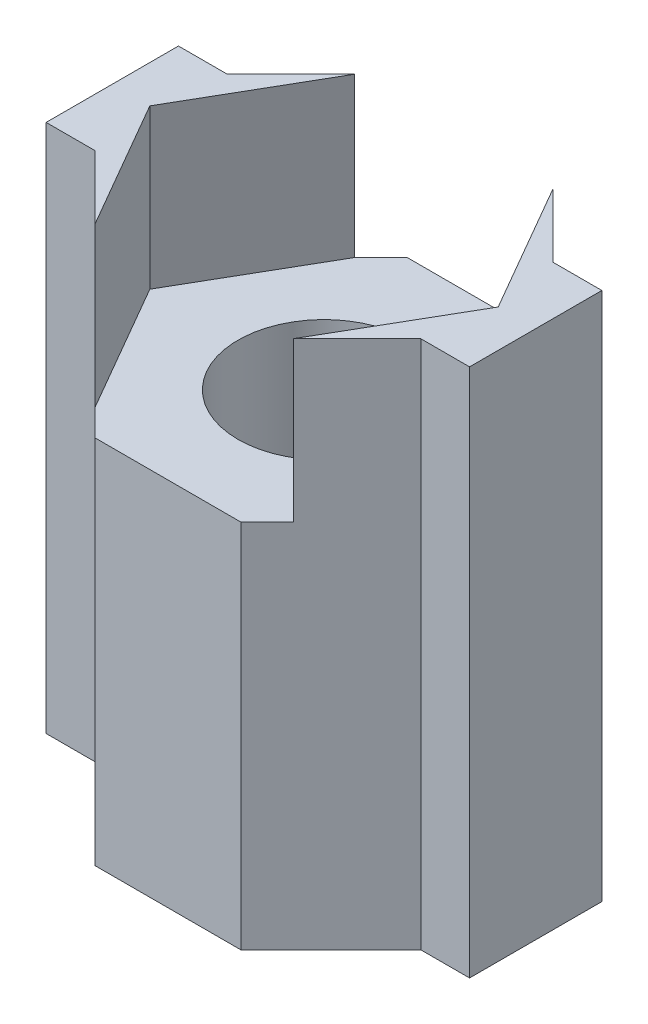
ISO-10303-21;
HEADER;
FILE_DESCRIPTION(('STEP AP214'),'2;1');
FILE_NAME('part.step','',(''),(''),'','','');
FILE_SCHEMA(('AUTOMOTIVE_DESIGN { 1 0 10303 214 1 1 1 1 }'));
ENDSEC;
DATA;
#1=APPLICATION_CONTEXT('core data for automotive mechanical design processes');
#2=APPLICATION_PROTOCOL_DEFINITION('international standard','automotive_design',2000,#1);
#3=PRODUCT_CONTEXT('',#1,'mechanical');
#4=PRODUCT('Part','Part','',(#3));
#5=PRODUCT_RELATED_PRODUCT_CATEGORY('part','',(#4));
#6=PRODUCT_DEFINITION_FORMATION('','',#4);
#7=PRODUCT_DEFINITION_CONTEXT('part definition',#1,'design');
#8=PRODUCT_DEFINITION('design','',#6,#7);
#9=PRODUCT_DEFINITION_SHAPE('','',#8);
#10=(LENGTH_UNIT() NAMED_UNIT(*) SI_UNIT(.MILLI.,.METRE.));
#11=(NAMED_UNIT(*) PLANE_ANGLE_UNIT() SI_UNIT($,.RADIAN.));
#12=(NAMED_UNIT(*) SI_UNIT($,.STERADIAN.) SOLID_ANGLE_UNIT());
#13=UNCERTAINTY_MEASURE_WITH_UNIT(LENGTH_MEASURE(1.E-05),#10,'distance_accuracy_value','');
#14=(GEOMETRIC_REPRESENTATION_CONTEXT(3) GLOBAL_UNCERTAINTY_ASSIGNED_CONTEXT((#13)) GLOBAL_UNIT_ASSIGNED_CONTEXT((#10,
#11,#12)) REPRESENTATION_CONTEXT('',''));
#15=CARTESIAN_POINT('',(0.,0.,0.));
#16=DIRECTION('',(0.,0.,1.));
#17=DIRECTION('',(1.,0.,0.));
#18=AXIS2_PLACEMENT_3D('',#15,#16,#17);
#19=CARTESIAN_POINT('',(0.,20.,0.));
#20=DIRECTION('',(0.,-1.,0.));
#21=DIRECTION('',(0.,0.,-1.));
#22=AXIS2_PLACEMENT_3D('',#19,#20,#21);
#23=PLANE('',#22);
#24=DIRECTION('',(0.707106781186547,0.,0.707106781186548));
#25=VECTOR('',#24,1.);
#26=CARTESIAN_POINT('',(-2.75649711574559,20.,5.90000000000002));
#27=LINE('',#26,#25);
#28=CARTESIAN_POINT('',(-6.1564971157456,20.,2.5));
#29=VERTEX_POINT('',#28);
#30=CARTESIAN_POINT('',(-3.74769463524738,20.,4.90880248049823));
#31=VERTEX_POINT('',#30);
#32=EDGE_CURVE('E243',#29,#31,#27,.T.);
#33=ORIENTED_EDGE('',*,*,#32,.T.);
#34=DIRECTION('',(0.5,0.,0.866025403784439));
#35=VECTOR('',#34,1.);
#36=CARTESIAN_POINT('',(-6.58179306876174,20.,0.));
#37=LINE('',#36,#35);
#38=CARTESIAN_POINT('',(-6.58179306876174,20.,0.));
#39=VERTEX_POINT('',#38);
#40=EDGE_CURVE('E224',#39,#31,#37,.T.);
#41=ORIENTED_EDGE('',*,*,#40,.F.);
#42=DIRECTION('',(0.5,0.,-0.866025403784439));
#43=VECTOR('',#42,1.);
#44=CARTESIAN_POINT('',(-4.9363448015713,20.,-2.85));
#45=LINE('',#44,#43);
#46=CARTESIAN_POINT('',(-3.74769463524745,20.,-4.9088024804981));
#47=VERTEX_POINT('',#46);
#48=EDGE_CURVE('E41',#39,#47,#45,.T.);
#49=ORIENTED_EDGE('',*,*,#48,.T.);
#50=DIRECTION('',(-0.707106781186547,0.,0.707106781186548));
#51=VECTOR('',#50,1.);
#52=CARTESIAN_POINT('',(-6.15649711574556,20.,-2.5));
#53=LINE('',#52,#51);
#54=CARTESIAN_POINT('',(-6.15649711574556,20.,-2.5));
#55=VERTEX_POINT('',#54);
#56=EDGE_CURVE('E157',#47,#55,#53,.T.);
#57=ORIENTED_EDGE('',*,*,#56,.T.);
#58=DIRECTION('',(-1.,0.,0.));
#59=VECTOR('',#58,1.);
#60=CARTESIAN_POINT('',(-8.00000000000005,20.,-2.5));
#61=LINE('',#60,#59);
#62=CARTESIAN_POINT('',(-8.00000000000005,20.,-2.5));
#63=VERTEX_POINT('',#62);
#64=EDGE_CURVE('E57',#55,#63,#61,.T.);
#65=ORIENTED_EDGE('',*,*,#64,.T.);
#66=DIRECTION('',(0.,0.,1.));
#67=VECTOR('',#66,1.);
#68=CARTESIAN_POINT('',(-8.00000000000005,20.,2.5));
#69=LINE('',#68,#67);
#70=CARTESIAN_POINT('',(-8.00000000000005,20.,2.5));
#71=VERTEX_POINT('',#70);
#72=EDGE_CURVE('E191',#63,#71,#69,.T.);
#73=ORIENTED_EDGE('',*,*,#72,.T.);
#74=DIRECTION('',(1.,0.,0.));
#75=VECTOR('',#74,1.);
#76=CARTESIAN_POINT('',(-6.1564971157456,20.,2.5));
#77=LINE('',#76,#75);
#78=EDGE_CURVE('E111',#71,#29,#77,.T.);
#79=ORIENTED_EDGE('',*,*,#78,.T.);
#80=EDGE_LOOP('',(#33,#41,#49,#57,#65,#73,#79));
#81=FACE_BOUND('',#80,.T.);
#82=ADVANCED_FACE('F33',(#81),#23,.F.);
#83=CARTESIAN_POINT('',(-8.00000000000005,20.,2.5));
#84=DIRECTION('',(1.,0.,0.));
#85=DIRECTION('',(0.,0.,-1.));
#86=AXIS2_PLACEMENT_3D('',#83,#84,#85);
#87=PLANE('',#86);
#88=DIRECTION('',(0.,0.,1.));
#89=VECTOR('',#88,1.);
#90=CARTESIAN_POINT('',(-8.00000000000005,0.,2.5));
#91=LINE('',#90,#89);
#92=CARTESIAN_POINT('',(-8.00000000000005,0.,-2.5));
#93=VERTEX_POINT('',#92);
#94=CARTESIAN_POINT('',(-8.00000000000005,0.,2.5));
#95=VERTEX_POINT('',#94);
#96=EDGE_CURVE('E164',#93,#95,#91,.T.);
#97=ORIENTED_EDGE('',*,*,#96,.T.);
#98=DIRECTION('',(0.,-1.,0.));
#99=VECTOR('',#98,1.);
#100=CARTESIAN_POINT('',(-8.00000000000005,20.,2.5));
#101=LINE('',#100,#99);
#102=EDGE_CURVE('E212',#71,#95,#101,.T.);
#103=ORIENTED_EDGE('',*,*,#102,.F.);
#104=ORIENTED_EDGE('',*,*,#72,.F.);
#105=DIRECTION('',(0.,-1.,0.));
#106=VECTOR('',#105,1.);
#107=CARTESIAN_POINT('',(-8.00000000000005,20.,-2.5));
#108=LINE('',#107,#106);
#109=EDGE_CURVE('E163',#63,#93,#108,.T.);
#110=ORIENTED_EDGE('',*,*,#109,.T.);
#111=EDGE_LOOP('',(#97,#103,#104,#110));
#112=FACE_BOUND('',#111,.T.);
#113=ADVANCED_FACE('F35',(#112),#87,.F.);
#114=CARTESIAN_POINT('',(-6.1564971157456,20.,2.5));
#115=DIRECTION('',(0.,0.,-1.));
#116=DIRECTION('',(-1.,0.,0.));
#117=AXIS2_PLACEMENT_3D('',#114,#115,#116);
#118=PLANE('',#117);
#119=DIRECTION('',(1.,0.,0.));
#120=VECTOR('',#119,1.);
#121=CARTESIAN_POINT('',(-6.1564971157456,0.,2.5));
#122=LINE('',#121,#120);
#123=CARTESIAN_POINT('',(-6.1564971157456,0.,2.5));
#124=VERTEX_POINT('',#123);
#125=EDGE_CURVE('E167',#95,#124,#122,.T.);
#126=ORIENTED_EDGE('',*,*,#125,.T.);
#127=DIRECTION('',(0.,-1.,0.));
#128=VECTOR('',#127,1.);
#129=CARTESIAN_POINT('',(-6.1564971157456,20.,2.5));
#130=LINE('',#129,#128);
#131=EDGE_CURVE('E209',#29,#124,#130,.T.);
#132=ORIENTED_EDGE('',*,*,#131,.F.);
#133=ORIENTED_EDGE('',*,*,#78,.F.);
#134=ORIENTED_EDGE('',*,*,#102,.T.);
#135=EDGE_LOOP('',(#126,#132,#133,#134));
#136=FACE_BOUND('',#135,.T.);
#137=ADVANCED_FACE('F357',(#136),#118,.F.);
#138=CARTESIAN_POINT('',(-2.75649711574559,20.,5.90000000000002));
#139=DIRECTION('',(0.707106781186548,0.,-0.707106781186547));
#140=DIRECTION('',(-0.707106781186547,0.,-0.707106781186548));
#141=AXIS2_PLACEMENT_3D('',#138,#139,#140);
#142=PLANE('',#141);
#143=DIRECTION('',(-0.707106781186547,0.,-0.707106781186548));
#144=VECTOR('',#143,1.);
#145=CARTESIAN_POINT('',(-2.75649711574559,14.,5.90000000000002));
#146=LINE('',#145,#144);
#147=CARTESIAN_POINT('',(-2.75649711574559,14.,5.90000000000002));
#148=VERTEX_POINT('',#147);
#149=CARTESIAN_POINT('',(-3.74769463524738,14.,4.90880248049823));
#150=VERTEX_POINT('',#149);
#151=EDGE_CURVE('E168',#148,#150,#146,.T.);
#152=ORIENTED_EDGE('',*,*,#151,.T.);
#153=DIRECTION('',(0.,1.,0.));
#154=VECTOR('',#153,1.);
#155=CARTESIAN_POINT('',(-3.74769463524739,20.,4.90880248049822));
#156=LINE('',#155,#154);
#157=EDGE_CURVE('E280',#150,#31,#156,.T.);
#158=ORIENTED_EDGE('',*,*,#157,.T.);
#159=ORIENTED_EDGE('',*,*,#32,.F.);
#160=ORIENTED_EDGE('',*,*,#131,.T.);
#161=DIRECTION('',(0.707106781186547,0.,0.707106781186548));
#162=VECTOR('',#161,1.);
#163=CARTESIAN_POINT('',(-2.75649711574559,0.,5.90000000000002));
#164=LINE('',#163,#162);
#165=CARTESIAN_POINT('',(-2.75649711574559,0.,5.90000000000002));
#166=VERTEX_POINT('',#165);
#167=EDGE_CURVE('E170',#124,#166,#164,.T.);
#168=ORIENTED_EDGE('',*,*,#167,.T.);
#169=DIRECTION('',(0.,-1.,0.));
#170=VECTOR('',#169,1.);
#171=CARTESIAN_POINT('',(-2.75649711574559,20.,5.90000000000002));
#172=LINE('',#171,#170);
#173=EDGE_CURVE('E207',#148,#166,#172,.T.);
#174=ORIENTED_EDGE('',*,*,#173,.F.);
#175=EDGE_LOOP('',(#152,#158,#159,#160,#168,#174));
#176=FACE_BOUND('',#175,.T.);
#177=ADVANCED_FACE('F299',(#176),#142,.F.);
#178=CARTESIAN_POINT('',(2.75649711574554,20.,5.90000000000002));
#179=DIRECTION('',(0.,0.,-1.));
#180=DIRECTION('',(-1.,0.,0.));
#181=AXIS2_PLACEMENT_3D('',#178,#179,#180);
#182=PLANE('',#181);
#183=DIRECTION('',(0.,-1.,0.));
#184=VECTOR('',#183,1.);
#185=CARTESIAN_POINT('',(2.75649711574554,20.,5.90000000000002));
#186=LINE('',#185,#184);
#187=CARTESIAN_POINT('',(2.75649711574554,14.,5.90000000000002));
#188=VERTEX_POINT('',#187);
#189=CARTESIAN_POINT('',(2.75649711574554,0.,5.90000000000002));
#190=VERTEX_POINT('',#189);
#191=EDGE_CURVE('E205',#188,#190,#186,.T.);
#192=ORIENTED_EDGE('',*,*,#191,.F.);
#193=DIRECTION('',(-1.,0.,0.));
#194=VECTOR('',#193,1.);
#195=CARTESIAN_POINT('',(2.75649711574554,14.,5.90000000000002));
#196=LINE('',#195,#194);
#197=EDGE_CURVE('E289',#188,#148,#196,.T.);
#198=ORIENTED_EDGE('',*,*,#197,.T.);
#199=ORIENTED_EDGE('',*,*,#173,.T.);
#200=DIRECTION('',(1.,0.,0.));
#201=VECTOR('',#200,1.);
#202=CARTESIAN_POINT('',(2.75649711574554,0.,5.90000000000002));
#203=LINE('',#202,#201);
#204=EDGE_CURVE('E173',#166,#190,#203,.T.);
#205=ORIENTED_EDGE('',*,*,#204,.T.);
#206=EDGE_LOOP('',(#192,#198,#199,#205));
#207=FACE_BOUND('',#206,.T.);
#208=ADVANCED_FACE('F356',(#207),#182,.F.);
#209=CARTESIAN_POINT('',(6.15649711574556,20.,2.5));
#210=DIRECTION('',(-0.707106781186548,0.,-0.707106781186548));
#211=DIRECTION('',(-0.707106781186548,0.,0.707106781186548));
#212=AXIS2_PLACEMENT_3D('',#209,#210,#211);
#213=PLANE('',#212);
#214=DIRECTION('',(0.707106781186547,0.,-0.707106781186547));
#215=VECTOR('',#214,1.);
#216=CARTESIAN_POINT('',(6.15649711574556,20.,2.5));
#217=LINE('',#216,#215);
#218=CARTESIAN_POINT('',(3.74769463524745,20.,4.90880248049811));
#219=VERTEX_POINT('',#218);
#220=CARTESIAN_POINT('',(6.15649711574556,20.,2.5));
#221=VERTEX_POINT('',#220);
#222=EDGE_CURVE('E249',#219,#221,#217,.T.);
#223=ORIENTED_EDGE('',*,*,#222,.F.);
#224=DIRECTION('',(0.,-1.,0.));
#225=VECTOR('',#224,1.);
#226=CARTESIAN_POINT('',(3.74769463524745,20.,4.9088024804981));
#227=LINE('',#226,#225);
#228=CARTESIAN_POINT('',(3.74769463524745,14.,4.90880248049811));
#229=VERTEX_POINT('',#228);
#230=EDGE_CURVE('E48',#219,#229,#227,.T.);
#231=ORIENTED_EDGE('',*,*,#230,.T.);
#232=DIRECTION('',(-0.707106781186548,0.,0.707106781186548));
#233=VECTOR('',#232,1.);
#234=CARTESIAN_POINT('',(6.15649711574556,14.,2.5));
#235=LINE('',#234,#233);
#236=EDGE_CURVE('E282',#229,#188,#235,.T.);
#237=ORIENTED_EDGE('',*,*,#236,.T.);
#238=ORIENTED_EDGE('',*,*,#191,.T.);
#239=DIRECTION('',(0.707106781186547,0.,-0.707106781186547));
#240=VECTOR('',#239,1.);
#241=CARTESIAN_POINT('',(6.15649711574556,0.,2.5));
#242=LINE('',#241,#240);
#243=CARTESIAN_POINT('',(6.15649711574556,0.,2.5));
#244=VERTEX_POINT('',#243);
#245=EDGE_CURVE('E176',#190,#244,#242,.T.);
#246=ORIENTED_EDGE('',*,*,#245,.T.);
#247=DIRECTION('',(0.,-1.,0.));
#248=VECTOR('',#247,1.);
#249=CARTESIAN_POINT('',(6.15649711574556,20.,2.5));
#250=LINE('',#249,#248);
#251=EDGE_CURVE('E202',#221,#244,#250,.T.);
#252=ORIENTED_EDGE('',*,*,#251,.F.);
#253=EDGE_LOOP('',(#223,#231,#237,#238,#246,#252));
#254=FACE_BOUND('',#253,.T.);
#255=ADVANCED_FACE('F352',(#254),#213,.F.);
#256=CARTESIAN_POINT('',(8.00000000000005,20.,2.5));
#257=DIRECTION('',(0.,0.,-1.));
#258=DIRECTION('',(-1.,0.,0.));
#259=AXIS2_PLACEMENT_3D('',#256,#257,#258);
#260=PLANE('',#259);
#261=DIRECTION('',(1.,0.,0.));
#262=VECTOR('',#261,1.);
#263=CARTESIAN_POINT('',(8.00000000000005,0.,2.5));
#264=LINE('',#263,#262);
#265=CARTESIAN_POINT('',(8.00000000000005,0.,2.5));
#266=VERTEX_POINT('',#265);
#267=EDGE_CURVE('E178',#244,#266,#264,.T.);
#268=ORIENTED_EDGE('',*,*,#267,.T.);
#269=DIRECTION('',(0.,-1.,0.));
#270=VECTOR('',#269,1.);
#271=CARTESIAN_POINT('',(8.00000000000005,20.,2.5));
#272=LINE('',#271,#270);
#273=CARTESIAN_POINT('',(8.00000000000005,20.,2.5));
#274=VERTEX_POINT('',#273);
#275=EDGE_CURVE('E199',#274,#266,#272,.T.);
#276=ORIENTED_EDGE('',*,*,#275,.F.);
#277=DIRECTION('',(1.,0.,0.));
#278=VECTOR('',#277,1.);
#279=CARTESIAN_POINT('',(8.00000000000005,20.,2.5));
#280=LINE('',#279,#278);
#281=EDGE_CURVE('E251',#221,#274,#280,.T.);
#282=ORIENTED_EDGE('',*,*,#281,.F.);
#283=ORIENTED_EDGE('',*,*,#251,.T.);
#284=EDGE_LOOP('',(#268,#276,#282,#283));
#285=FACE_BOUND('',#284,.T.);
#286=ADVANCED_FACE('F257',(#285),#260,.F.);
#287=CARTESIAN_POINT('',(8.00000000000005,20.,-2.5));
#288=DIRECTION('',(-1.,0.,0.));
#289=DIRECTION('',(0.,0.,1.));
#290=AXIS2_PLACEMENT_3D('',#287,#288,#289);
#291=PLANE('',#290);
#292=DIRECTION('',(0.,0.,-1.));
#293=VECTOR('',#292,1.);
#294=CARTESIAN_POINT('',(8.00000000000005,0.,-2.5));
#295=LINE('',#294,#293);
#296=CARTESIAN_POINT('',(8.00000000000005,0.,-2.5));
#297=VERTEX_POINT('',#296);
#298=EDGE_CURVE('E180',#266,#297,#295,.T.);
#299=ORIENTED_EDGE('',*,*,#298,.T.);
#300=DIRECTION('',(0.,-1.,0.));
#301=VECTOR('',#300,1.);
#302=CARTESIAN_POINT('',(8.00000000000005,20.,-2.5));
#303=LINE('',#302,#301);
#304=CARTESIAN_POINT('',(8.00000000000005,20.,-2.5));
#305=VERTEX_POINT('',#304);
#306=EDGE_CURVE('E149',#305,#297,#303,.T.);
#307=ORIENTED_EDGE('',*,*,#306,.F.);
#308=DIRECTION('',(0.,0.,-1.));
#309=VECTOR('',#308,1.);
#310=CARTESIAN_POINT('',(8.00000000000005,20.,-2.5));
#311=LINE('',#310,#309);
#312=EDGE_CURVE('E136',#274,#305,#311,.T.);
#313=ORIENTED_EDGE('',*,*,#312,.F.);
#314=ORIENTED_EDGE('',*,*,#275,.T.);
#315=EDGE_LOOP('',(#299,#307,#313,#314));
#316=FACE_BOUND('',#315,.T.);
#317=ADVANCED_FACE('F261',(#316),#291,.F.);
#318=CARTESIAN_POINT('',(6.15649711574561,20.,-2.5));
#319=DIRECTION('',(0.,0.,1.));
#320=DIRECTION('',(1.,0.,0.));
#321=AXIS2_PLACEMENT_3D('',#318,#319,#320);
#322=PLANE('',#321);
#323=DIRECTION('',(-1.,0.,0.));
#324=VECTOR('',#323,1.);
#325=CARTESIAN_POINT('',(6.15649711574561,0.,-2.5));
#326=LINE('',#325,#324);
#327=CARTESIAN_POINT('',(6.15649711574561,0.,-2.5));
#328=VERTEX_POINT('',#327);
#329=EDGE_CURVE('E145',#297,#328,#326,.T.);
#330=ORIENTED_EDGE('',*,*,#329,.T.);
#331=DIRECTION('',(0.,-1.,0.));
#332=VECTOR('',#331,1.);
#333=CARTESIAN_POINT('',(6.15649711574561,20.,-2.5));
#334=LINE('',#333,#332);
#335=CARTESIAN_POINT('',(6.15649711574561,20.,-2.5));
#336=VERTEX_POINT('',#335);
#337=EDGE_CURVE('E142',#336,#328,#334,.T.);
#338=ORIENTED_EDGE('',*,*,#337,.F.);
#339=DIRECTION('',(-1.,0.,0.));
#340=VECTOR('',#339,1.);
#341=CARTESIAN_POINT('',(6.15649711574561,20.,-2.5));
#342=LINE('',#341,#340);
#343=EDGE_CURVE('E128',#305,#336,#342,.T.);
#344=ORIENTED_EDGE('',*,*,#343,.F.);
#345=ORIENTED_EDGE('',*,*,#306,.T.);
#346=EDGE_LOOP('',(#330,#338,#344,#345));
#347=FACE_BOUND('',#346,.T.);
#348=ADVANCED_FACE('F143',(#347),#322,.F.);
#349=CARTESIAN_POINT('',(2.75649711574559,20.,-5.90000000000002));
#350=DIRECTION('',(-0.707106781186548,0.,0.707106781186548));
#351=DIRECTION('',(0.707106781186548,0.,0.707106781186548));
#352=AXIS2_PLACEMENT_3D('',#349,#350,#351);
#353=PLANE('',#352);
#354=DIRECTION('',(0.707106781186548,0.,0.707106781186548));
#355=VECTOR('',#354,1.);
#356=CARTESIAN_POINT('',(2.75649711574559,14.,-5.90000000000002));
#357=LINE('',#356,#355);
#358=CARTESIAN_POINT('',(2.75649711574559,14.,-5.90000000000002));
#359=VERTEX_POINT('',#358);
#360=CARTESIAN_POINT('',(3.74769463524739,14.,-4.90880248049822));
#361=VERTEX_POINT('',#360);
#362=EDGE_CURVE('E268',#359,#361,#357,.T.);
#363=ORIENTED_EDGE('',*,*,#362,.T.);
#364=DIRECTION('',(0.,1.,0.));
#365=VECTOR('',#364,1.);
#366=CARTESIAN_POINT('',(3.74769463524738,20.,-4.90880248049823));
#367=LINE('',#366,#365);
#368=CARTESIAN_POINT('',(3.74769463524737,20.,-4.90880248049824));
#369=VERTEX_POINT('',#368);
#370=EDGE_CURVE('E156',#361,#369,#367,.T.);
#371=ORIENTED_EDGE('',*,*,#370,.T.);
#372=DIRECTION('',(-0.707106781186548,0.,-0.707106781186548));
#373=VECTOR('',#372,1.);
#374=CARTESIAN_POINT('',(2.75649711574559,20.,-5.90000000000002));
#375=LINE('',#374,#373);
#376=EDGE_CURVE('E134',#336,#369,#375,.T.);
#377=ORIENTED_EDGE('',*,*,#376,.F.);
#378=ORIENTED_EDGE('',*,*,#337,.T.);
#379=DIRECTION('',(-0.707106781186548,0.,-0.707106781186548));
#380=VECTOR('',#379,1.);
#381=CARTESIAN_POINT('',(2.75649711574559,0.,-5.90000000000002));
#382=LINE('',#381,#380);
#383=CARTESIAN_POINT('',(2.75649711574559,0.,-5.90000000000002));
#384=VERTEX_POINT('',#383);
#385=EDGE_CURVE('E183',#328,#384,#382,.T.);
#386=ORIENTED_EDGE('',*,*,#385,.T.);
#387=DIRECTION('',(0.,-1.,0.));
#388=VECTOR('',#387,1.);
#389=CARTESIAN_POINT('',(2.75649711574559,20.,-5.90000000000002));
#390=LINE('',#389,#388);
#391=EDGE_CURVE('E150',#359,#384,#390,.T.);
#392=ORIENTED_EDGE('',*,*,#391,.F.);
#393=EDGE_LOOP('',(#363,#371,#377,#378,#386,#392));
#394=FACE_BOUND('',#393,.T.);
#395=ADVANCED_FACE('F154',(#394),#353,.F.);
#396=CARTESIAN_POINT('',(-2.75649711574554,20.,-5.90000000000002));
#397=DIRECTION('',(0.,0.,1.));
#398=DIRECTION('',(1.,0.,0.));
#399=AXIS2_PLACEMENT_3D('',#396,#397,#398);
#400=PLANE('',#399);
#401=DIRECTION('',(0.,-1.,0.));
#402=VECTOR('',#401,1.);
#403=CARTESIAN_POINT('',(-2.75649711574554,20.,-5.90000000000002));
#404=LINE('',#403,#402);
#405=CARTESIAN_POINT('',(-2.75649711574554,14.,-5.90000000000002));
#406=VERTEX_POINT('',#405);
#407=CARTESIAN_POINT('',(-2.75649711574554,0.,-5.90000000000002));
#408=VERTEX_POINT('',#407);
#409=EDGE_CURVE('E195',#406,#408,#404,.T.);
#410=ORIENTED_EDGE('',*,*,#409,.F.);
#411=DIRECTION('',(1.,0.,0.));
#412=VECTOR('',#411,1.);
#413=CARTESIAN_POINT('',(-2.75649711574554,14.,-5.90000000000002));
#414=LINE('',#413,#412);
#415=EDGE_CURVE('E277',#406,#359,#414,.T.);
#416=ORIENTED_EDGE('',*,*,#415,.T.);
#417=ORIENTED_EDGE('',*,*,#391,.T.);
#418=DIRECTION('',(-1.,0.,0.));
#419=VECTOR('',#418,1.);
#420=CARTESIAN_POINT('',(-2.75649711574554,0.,-5.90000000000002));
#421=LINE('',#420,#419);
#422=EDGE_CURVE('E185',#384,#408,#421,.T.);
#423=ORIENTED_EDGE('',*,*,#422,.T.);
#424=EDGE_LOOP('',(#410,#416,#417,#423));
#425=FACE_BOUND('',#424,.T.);
#426=ADVANCED_FACE('F275',(#425),#400,.F.);
#427=CARTESIAN_POINT('',(-6.15649711574556,20.,-2.5));
#428=DIRECTION('',(0.707106781186548,0.,0.707106781186547));
#429=DIRECTION('',(0.707106781186547,0.,-0.707106781186548));
#430=AXIS2_PLACEMENT_3D('',#427,#428,#429);
#431=PLANE('',#430);
#432=ORIENTED_EDGE('',*,*,#56,.F.);
#433=DIRECTION('',(0.,-1.,0.));
#434=VECTOR('',#433,1.);
#435=CARTESIAN_POINT('',(-3.74769463524745,20.,-4.90880248049811));
#436=LINE('',#435,#434);
#437=CARTESIAN_POINT('',(-3.74769463524744,14.,-4.90880248049812));
#438=VERTEX_POINT('',#437);
#439=EDGE_CURVE('E235',#47,#438,#436,.T.);
#440=ORIENTED_EDGE('',*,*,#439,.T.);
#441=DIRECTION('',(0.707106781186547,0.,-0.707106781186548));
#442=VECTOR('',#441,1.);
#443=CARTESIAN_POINT('',(-6.15649711574556,14.,-2.5));
#444=LINE('',#443,#442);
#445=EDGE_CURVE('E11',#438,#406,#444,.T.);
#446=ORIENTED_EDGE('',*,*,#445,.T.);
#447=ORIENTED_EDGE('',*,*,#409,.T.);
#448=DIRECTION('',(-0.707106781186547,0.,0.707106781186548));
#449=VECTOR('',#448,1.);
#450=CARTESIAN_POINT('',(-6.15649711574556,0.,-2.5));
#451=LINE('',#450,#449);
#452=CARTESIAN_POINT('',(-6.15649711574556,0.,-2.5));
#453=VERTEX_POINT('',#452);
#454=EDGE_CURVE('E188',#408,#453,#451,.T.);
#455=ORIENTED_EDGE('',*,*,#454,.T.);
#456=DIRECTION('',(0.,-1.,0.));
#457=VECTOR('',#456,1.);
#458=CARTESIAN_POINT('',(-6.15649711574556,20.,-2.5));
#459=LINE('',#458,#457);
#460=EDGE_CURVE('E193',#55,#453,#459,.T.);
#461=ORIENTED_EDGE('',*,*,#460,.F.);
#462=EDGE_LOOP('',(#432,#440,#446,#447,#455,#461));
#463=FACE_BOUND('',#462,.T.);
#464=ADVANCED_FACE('F234',(#463),#431,.F.);
#465=CARTESIAN_POINT('',(-8.00000000000005,20.,-2.5));
#466=DIRECTION('',(0.,0.,1.));
#467=DIRECTION('',(1.,0.,0.));
#468=AXIS2_PLACEMENT_3D('',#465,#466,#467);
#469=PLANE('',#468);
#470=DIRECTION('',(-1.,0.,0.));
#471=VECTOR('',#470,1.);
#472=CARTESIAN_POINT('',(-8.00000000000005,0.,-2.5));
#473=LINE('',#472,#471);
#474=EDGE_CURVE('E102',#453,#93,#473,.T.);
#475=ORIENTED_EDGE('',*,*,#474,.T.);
#476=ORIENTED_EDGE('',*,*,#109,.F.);
#477=ORIENTED_EDGE('',*,*,#64,.F.);
#478=ORIENTED_EDGE('',*,*,#460,.T.);
#479=EDGE_LOOP('',(#475,#476,#477,#478));
#480=FACE_BOUND('',#479,.T.);
#481=ADVANCED_FACE('F237',(#480),#469,.F.);
#482=ORIENTED_EDGE('',*,*,#376,.T.);
#483=DIRECTION('',(-0.5,0.,-0.866025403784439));
#484=VECTOR('',#483,1.);
#485=CARTESIAN_POINT('',(6.58179306876173,20.,0.));
#486=LINE('',#485,#484);
#487=CARTESIAN_POINT('',(6.58179306876173,20.,0.));
#488=VERTEX_POINT('',#487);
#489=EDGE_CURVE('E345',#488,#369,#486,.T.);
#490=ORIENTED_EDGE('',*,*,#489,.F.);
#491=DIRECTION('',(-0.5,0.,0.866025403784439));
#492=VECTOR('',#491,1.);
#493=CARTESIAN_POINT('',(4.9363448015713,20.,2.85));
#494=LINE('',#493,#492);
#495=EDGE_CURVE('E214',#488,#219,#494,.T.);
#496=ORIENTED_EDGE('',*,*,#495,.T.);
#497=ORIENTED_EDGE('',*,*,#222,.T.);
#498=ORIENTED_EDGE('',*,*,#281,.T.);
#499=ORIENTED_EDGE('',*,*,#312,.T.);
#500=ORIENTED_EDGE('',*,*,#343,.T.);
#501=EDGE_LOOP('',(#482,#490,#496,#497,#498,#499,#500));
#502=FACE_BOUND('',#501,.T.);
#503=ADVANCED_FACE('F130',(#502),#23,.F.);
#504=CARTESIAN_POINT('',(0.,0.,0.));
#505=DIRECTION('',(0.,-1.,0.));
#506=DIRECTION('',(0.,0.,-1.));
#507=AXIS2_PLACEMENT_3D('',#504,#505,#506);
#508=PLANE('',#507);
#509=CARTESIAN_POINT('',(0.,0.,0.));
#510=DIRECTION('',(0.,1.,0.));
#511=DIRECTION('',(0.,0.,1.));
#512=AXIS2_PLACEMENT_3D('',#509,#510,#511);
#513=CIRCLE('',#512,3.25);
#514=CARTESIAN_POINT('',(0.,0.,3.25));
#515=VERTEX_POINT('',#514);
#516=EDGE_CURVE('E347',#515,#515,#513,.T.);
#517=ORIENTED_EDGE('',*,*,#516,.T.);
#518=EDGE_LOOP('',(#517));
#519=FACE_BOUND('',#518,.T.);
#520=ORIENTED_EDGE('',*,*,#96,.F.);
#521=ORIENTED_EDGE('',*,*,#474,.F.);
#522=ORIENTED_EDGE('',*,*,#454,.F.);
#523=ORIENTED_EDGE('',*,*,#422,.F.);
#524=ORIENTED_EDGE('',*,*,#385,.F.);
#525=ORIENTED_EDGE('',*,*,#329,.F.);
#526=ORIENTED_EDGE('',*,*,#298,.F.);
#527=ORIENTED_EDGE('',*,*,#267,.F.);
#528=ORIENTED_EDGE('',*,*,#245,.F.);
#529=ORIENTED_EDGE('',*,*,#204,.F.);
#530=ORIENTED_EDGE('',*,*,#167,.F.);
#531=ORIENTED_EDGE('',*,*,#125,.F.);
#532=EDGE_LOOP('',(#520,#521,#522,#523,#524,#525,#526,#527,#528,#529,#530,#531));
#533=FACE_BOUND('',#532,.T.);
#534=ADVANCED_FACE('F263',(#519,#533),#508,.T.);
#535=CARTESIAN_POINT('',(0.,14.,0.));
#536=DIRECTION('',(0.,-1.,0.));
#537=DIRECTION('',(0.,0.,-1.));
#538=AXIS2_PLACEMENT_3D('',#535,#536,#537);
#539=PLANE('',#538);
#540=CARTESIAN_POINT('',(0.,14.,0.));
#541=DIRECTION('',(0.,1.,0.));
#542=DIRECTION('',(0.,0.,1.));
#543=AXIS2_PLACEMENT_3D('',#540,#541,#542);
#544=CIRCLE('',#543,3.25);
#545=CARTESIAN_POINT('',(0.,14.,3.25));
#546=VERTEX_POINT('',#545);
#547=EDGE_CURVE('E501',#546,#546,#544,.T.);
#548=ORIENTED_EDGE('',*,*,#547,.F.);
#549=EDGE_LOOP('',(#548));
#550=FACE_BOUND('',#549,.T.);
#551=ORIENTED_EDGE('',*,*,#197,.F.);
#552=ORIENTED_EDGE('',*,*,#236,.F.);
#553=DIRECTION('',(0.5,0.,-0.866025403784439));
#554=VECTOR('',#553,1.);
#555=CARTESIAN_POINT('',(3.29089653438087,14.,5.7));
#556=LINE('',#555,#554);
#557=CARTESIAN_POINT('',(6.58179306876173,14.,0.));
#558=VERTEX_POINT('',#557);
#559=EDGE_CURVE('E327',#229,#558,#556,.T.);
#560=ORIENTED_EDGE('',*,*,#559,.T.);
#561=DIRECTION('',(-0.5,0.,-0.866025403784439));
#562=VECTOR('',#561,1.);
#563=CARTESIAN_POINT('',(6.58179306876173,14.,0.));
#564=LINE('',#563,#562);
#565=EDGE_CURVE('E330',#558,#361,#564,.T.);
#566=ORIENTED_EDGE('',*,*,#565,.T.);
#567=ORIENTED_EDGE('',*,*,#362,.F.);
#568=ORIENTED_EDGE('',*,*,#415,.F.);
#569=ORIENTED_EDGE('',*,*,#445,.F.);
#570=DIRECTION('',(-0.5,0.,0.866025403784439));
#571=VECTOR('',#570,1.);
#572=CARTESIAN_POINT('',(-3.29089653438087,14.,-5.7));
#573=LINE('',#572,#571);
#574=CARTESIAN_POINT('',(-6.58179306876174,14.,0.));
#575=VERTEX_POINT('',#574);
#576=EDGE_CURVE('E339',#438,#575,#573,.T.);
#577=ORIENTED_EDGE('',*,*,#576,.T.);
#578=DIRECTION('',(0.5,0.,0.866025403784439));
#579=VECTOR('',#578,1.);
#580=CARTESIAN_POINT('',(-6.58179306876174,14.,0.));
#581=LINE('',#580,#579);
#582=EDGE_CURVE('E309',#575,#150,#581,.T.);
#583=ORIENTED_EDGE('',*,*,#582,.T.);
#584=ORIENTED_EDGE('',*,*,#151,.F.);
#585=EDGE_LOOP('',(#551,#552,#560,#566,#567,#568,#569,#577,#583,#584));
#586=FACE_BOUND('',#585,.T.);
#587=ADVANCED_FACE('F305',(#550,#586),#539,.F.);
#588=CARTESIAN_POINT('',(-6.58179306876174,14.,0.));
#589=DIRECTION('',(-0.866025403784439,0.,0.5));
#590=DIRECTION('',(0.5,0.,0.866025403784439));
#591=AXIS2_PLACEMENT_3D('',#588,#589,#590);
#592=PLANE('',#591);
#593=ORIENTED_EDGE('',*,*,#582,.F.);
#594=DIRECTION('',(0.,1.,0.));
#595=VECTOR('',#594,1.);
#596=CARTESIAN_POINT('',(-6.58179306876174,14.,0.));
#597=LINE('',#596,#595);
#598=EDGE_CURVE('E336',#575,#39,#597,.T.);
#599=ORIENTED_EDGE('',*,*,#598,.T.);
#600=ORIENTED_EDGE('',*,*,#40,.T.);
#601=ORIENTED_EDGE('',*,*,#157,.F.);
#602=EDGE_LOOP('',(#593,#599,#600,#601));
#603=FACE_BOUND('',#602,.T.);
#604=ADVANCED_FACE('F438',(#603),#592,.F.);
#605=CARTESIAN_POINT('',(-3.29089653438087,14.,-5.7));
#606=DIRECTION('',(-0.866025403784439,0.,-0.5));
#607=DIRECTION('',(-0.5,0.,0.866025403784439));
#608=AXIS2_PLACEMENT_3D('',#605,#606,#607);
#609=PLANE('',#608);
#610=ORIENTED_EDGE('',*,*,#48,.F.);
#611=ORIENTED_EDGE('',*,*,#598,.F.);
#612=ORIENTED_EDGE('',*,*,#576,.F.);
#613=ORIENTED_EDGE('',*,*,#439,.F.);
#614=EDGE_LOOP('',(#610,#611,#612,#613));
#615=FACE_BOUND('',#614,.T.);
#616=ADVANCED_FACE('F443',(#615),#609,.F.);
#617=CARTESIAN_POINT('',(6.58179306876173,14.,0.));
#618=DIRECTION('',(0.866025403784439,0.,-0.5));
#619=DIRECTION('',(-0.5,0.,-0.866025403784439));
#620=AXIS2_PLACEMENT_3D('',#617,#618,#619);
#621=PLANE('',#620);
#622=ORIENTED_EDGE('',*,*,#565,.F.);
#623=DIRECTION('',(0.,1.,0.));
#624=VECTOR('',#623,1.);
#625=CARTESIAN_POINT('',(6.58179306876173,14.,0.));
#626=LINE('',#625,#624);
#627=EDGE_CURVE('E333',#558,#488,#626,.T.);
#628=ORIENTED_EDGE('',*,*,#627,.T.);
#629=ORIENTED_EDGE('',*,*,#489,.T.);
#630=ORIENTED_EDGE('',*,*,#370,.F.);
#631=EDGE_LOOP('',(#622,#628,#629,#630));
#632=FACE_BOUND('',#631,.T.);
#633=ADVANCED_FACE('F338',(#632),#621,.F.);
#634=CARTESIAN_POINT('',(3.29089653438087,14.,5.7));
#635=DIRECTION('',(0.866025403784439,0.,0.5));
#636=DIRECTION('',(0.5,0.,-0.866025403784439));
#637=AXIS2_PLACEMENT_3D('',#634,#635,#636);
#638=PLANE('',#637);
#639=ORIENTED_EDGE('',*,*,#495,.F.);
#640=ORIENTED_EDGE('',*,*,#627,.F.);
#641=ORIENTED_EDGE('',*,*,#559,.F.);
#642=ORIENTED_EDGE('',*,*,#230,.F.);
#643=EDGE_LOOP('',(#639,#640,#641,#642));
#644=FACE_BOUND('',#643,.T.);
#645=ADVANCED_FACE('F334',(#644),#638,.F.);
#646=CARTESIAN_POINT('',(0.,0.,0.));
#647=DIRECTION('',(0.,1.,0.));
#648=DIRECTION('',(0.,0.,1.));
#649=AXIS2_PLACEMENT_3D('',#646,#647,#648);
#650=CYLINDRICAL_SURFACE('',#649,3.25);
#651=ORIENTED_EDGE('',*,*,#516,.F.);
#652=EDGE_LOOP('',(#651));
#653=FACE_BOUND('',#652,.T.);
#654=ORIENTED_EDGE('',*,*,#547,.T.);
#655=EDGE_LOOP('',(#654));
#656=FACE_BOUND('',#655,.T.);
#657=ADVANCED_FACE('F471',(#653,#656),#650,.F.);
#658=CLOSED_SHELL('',(#82,#113,#137,#177,#208,#255,#286,#317,#348,#395,#426,#464,#481,#503,#534,
#587,#604,#616,#633,#645,#657));
#659=MANIFOLD_SOLID_BREP('B2',#658);
#660=ADVANCED_BREP_SHAPE_REPRESENTATION('',(#18,#659),#14);
#661=SHAPE_DEFINITION_REPRESENTATION(#9,#660);
ENDSEC;
END-ISO-10303-21;
